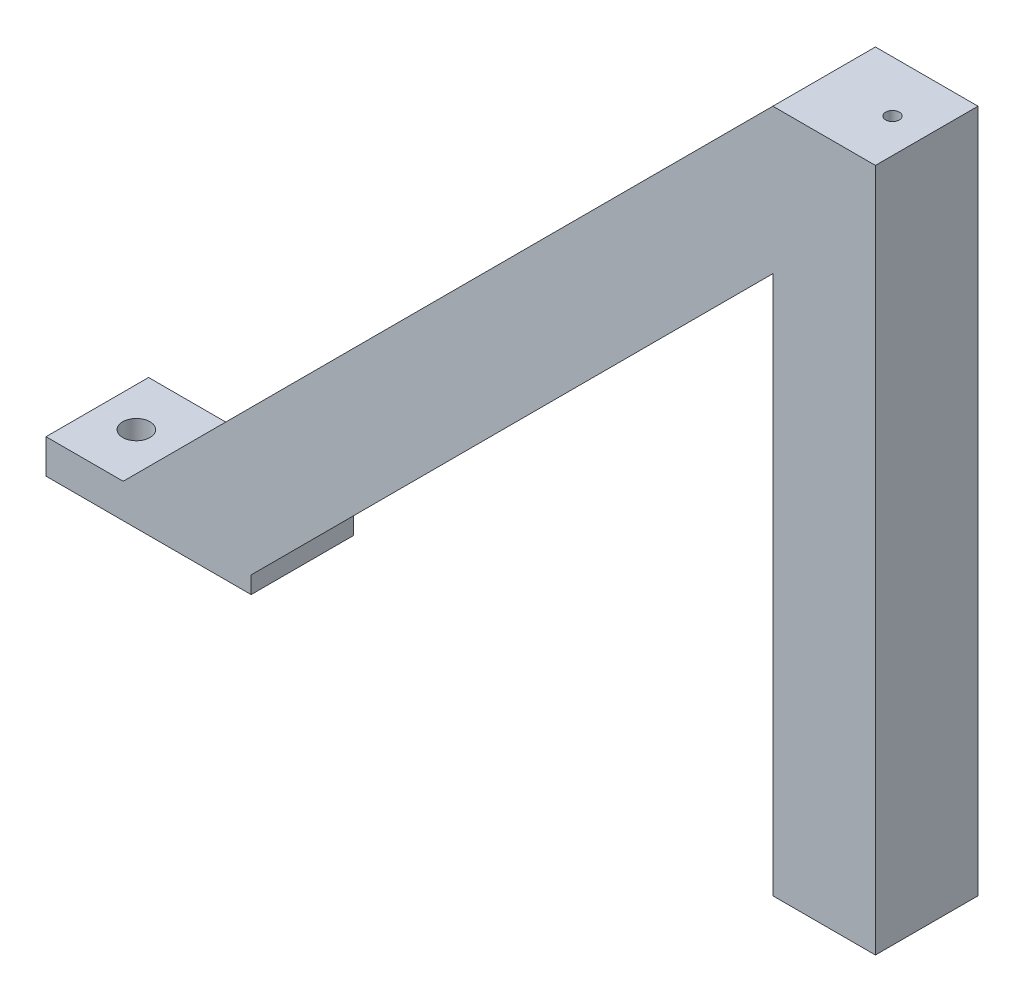
ISO-10303-21;
HEADER;
FILE_DESCRIPTION(('STEP AP214'),'2;1');
FILE_NAME('part.step','',(''),(''),'','','');
FILE_SCHEMA(('AUTOMOTIVE_DESIGN { 1 0 10303 214 1 1 1 1 }'));
ENDSEC;
DATA;
#1=APPLICATION_CONTEXT('core data for automotive mechanical design processes');
#2=APPLICATION_PROTOCOL_DEFINITION('international standard','automotive_design',2000,#1);
#3=PRODUCT_CONTEXT('',#1,'mechanical');
#4=PRODUCT('Part','Part','',(#3));
#5=PRODUCT_RELATED_PRODUCT_CATEGORY('part','',(#4));
#6=PRODUCT_DEFINITION_FORMATION('','',#4);
#7=PRODUCT_DEFINITION_CONTEXT('part definition',#1,'design');
#8=PRODUCT_DEFINITION('design','',#6,#7);
#9=PRODUCT_DEFINITION_SHAPE('','',#8);
#10=(LENGTH_UNIT() NAMED_UNIT(*) SI_UNIT(.MILLI.,.METRE.));
#11=(NAMED_UNIT(*) PLANE_ANGLE_UNIT() SI_UNIT($,.RADIAN.));
#12=(NAMED_UNIT(*) SI_UNIT($,.STERADIAN.) SOLID_ANGLE_UNIT());
#13=UNCERTAINTY_MEASURE_WITH_UNIT(LENGTH_MEASURE(1.E-05),#10,'distance_accuracy_value','');
#14=(GEOMETRIC_REPRESENTATION_CONTEXT(3) GLOBAL_UNCERTAINTY_ASSIGNED_CONTEXT((#13)) GLOBAL_UNIT_ASSIGNED_CONTEXT((#10,
#11,#12)) REPRESENTATION_CONTEXT('',''));
#15=CARTESIAN_POINT('',(0.,0.,0.));
#16=DIRECTION('',(0.,0.,1.));
#17=DIRECTION('',(1.,0.,0.));
#18=AXIS2_PLACEMENT_3D('',#15,#16,#17);
#19=CARTESIAN_POINT('',(-73.025,73.0250000000002,9.525));
#20=DIRECTION('',(0.707106781186546,-0.707106781186549,0.));
#21=DIRECTION('',(0.707106781186549,0.707106781186546,0.));
#22=AXIS2_PLACEMENT_3D('',#19,#20,#21);
#23=PLANE('',#22);
#24=DIRECTION('',(-0.707106781186549,-0.707106781186546,0.));
#25=VECTOR('',#24,1.);
#26=CARTESIAN_POINT('',(-73.025,73.0250000000002,-9.525));
#27=LINE('',#26,#25);
#28=CARTESIAN_POINT('',(-19.05,127.,-9.525));
#29=VERTEX_POINT('',#28);
#30=CARTESIAN_POINT('',(-139.7,6.35,-9.525));
#31=VERTEX_POINT('',#30);
#32=EDGE_CURVE('E133',#29,#31,#27,.T.);
#33=ORIENTED_EDGE('',*,*,#32,.T.);
#34=DIRECTION('',(0.,0.,1.));
#35=VECTOR('',#34,1.);
#36=CARTESIAN_POINT('',(-139.7,6.34999999999998,9.525));
#37=LINE('',#36,#35);
#38=CARTESIAN_POINT('',(-139.7,6.35,9.525));
#39=VERTEX_POINT('',#38);
#40=EDGE_CURVE('E181',#31,#39,#37,.T.);
#41=ORIENTED_EDGE('',*,*,#40,.T.);
#42=DIRECTION('',(-0.707106781186549,-0.707106781186546,0.));
#43=VECTOR('',#42,1.);
#44=CARTESIAN_POINT('',(-73.025,73.0250000000002,9.525));
#45=LINE('',#44,#43);
#46=CARTESIAN_POINT('',(-19.05,127.,9.525));
#47=VERTEX_POINT('',#46);
#48=EDGE_CURVE('E152',#47,#39,#45,.T.);
#49=ORIENTED_EDGE('',*,*,#48,.F.);
#50=DIRECTION('',(0.,0.,-1.));
#51=VECTOR('',#50,1.);
#52=CARTESIAN_POINT('',(-19.05,127.,9.525));
#53=LINE('',#52,#51);
#54=EDGE_CURVE('E132',#47,#29,#53,.T.);
#55=ORIENTED_EDGE('',*,*,#54,.T.);
#56=EDGE_LOOP('',(#33,#41,#49,#55));
#57=FACE_BOUND('',#56,.T.);
#58=ADVANCED_FACE('F41',(#57),#23,.F.);
#59=CARTESIAN_POINT('',(-59.5546158183963,59.5546158183965,9.525));
#60=DIRECTION('',(-0.707106781186546,0.707106781186549,0.));
#61=DIRECTION('',(-0.707106781186549,-0.707106781186546,0.));
#62=AXIS2_PLACEMENT_3D('',#59,#60,#61);
#63=PLANE('',#62);
#64=DIRECTION('',(0.707106781186549,0.707106781186546,0.));
#65=VECTOR('',#64,1.);
#66=CARTESIAN_POINT('',(-59.5546158183963,59.5546158183965,-9.525));
#67=LINE('',#66,#65);
#68=CARTESIAN_POINT('',(-115.934231636793,3.17499999999999,-9.525));
#69=VERTEX_POINT('',#68);
#70=CARTESIAN_POINT('',(-19.05,100.059231636793,-9.525));
#71=VERTEX_POINT('',#70);
#72=EDGE_CURVE('E137',#69,#71,#67,.T.);
#73=ORIENTED_EDGE('',*,*,#72,.T.);
#74=DIRECTION('',(0.,0.,-1.));
#75=VECTOR('',#74,1.);
#76=CARTESIAN_POINT('',(-19.05,100.059231636793,9.525));
#77=LINE('',#76,#75);
#78=CARTESIAN_POINT('',(-19.05,100.059231636793,9.525));
#79=VERTEX_POINT('',#78);
#80=EDGE_CURVE('E51',#79,#71,#77,.T.);
#81=ORIENTED_EDGE('',*,*,#80,.F.);
#82=DIRECTION('',(0.707106781186549,0.707106781186546,0.));
#83=VECTOR('',#82,1.);
#84=CARTESIAN_POINT('',(-59.5546158183963,59.5546158183965,9.525));
#85=LINE('',#84,#83);
#86=CARTESIAN_POINT('',(-115.934231636793,3.17499999999998,9.525));
#87=VERTEX_POINT('',#86);
#88=EDGE_CURVE('E96',#87,#79,#85,.T.);
#89=ORIENTED_EDGE('',*,*,#88,.F.);
#90=DIRECTION('',(0.,0.,-1.));
#91=VECTOR('',#90,1.);
#92=CARTESIAN_POINT('',(-115.934231636793,3.17499999999999,9.525));
#93=LINE('',#92,#91);
#94=EDGE_CURVE('E11',#87,#69,#93,.T.);
#95=ORIENTED_EDGE('',*,*,#94,.T.);
#96=EDGE_LOOP('',(#73,#81,#89,#95));
#97=FACE_BOUND('',#96,.T.);
#98=ADVANCED_FACE('F165',(#97),#63,.F.);
#99=CARTESIAN_POINT('',(-19.05,0.,9.525));
#100=DIRECTION('',(-1.,0.,0.));
#101=DIRECTION('',(0.,0.,1.));
#102=AXIS2_PLACEMENT_3D('',#99,#100,#101);
#103=PLANE('',#102);
#104=DIRECTION('',(0.,1.,0.));
#105=VECTOR('',#104,1.);
#106=CARTESIAN_POINT('',(-19.05,0.,-9.525));
#107=LINE('',#106,#105);
#108=CARTESIAN_POINT('',(-19.05,0.,-9.525));
#109=VERTEX_POINT('',#108);
#110=EDGE_CURVE('E142',#109,#71,#107,.T.);
#111=ORIENTED_EDGE('',*,*,#110,.F.);
#112=DIRECTION('',(0.,0.,-1.));
#113=VECTOR('',#112,1.);
#114=CARTESIAN_POINT('',(-19.05,0.,9.525));
#115=LINE('',#114,#113);
#116=CARTESIAN_POINT('',(-19.05,0.,9.525));
#117=VERTEX_POINT('',#116);
#118=EDGE_CURVE('E114',#117,#109,#115,.T.);
#119=ORIENTED_EDGE('',*,*,#118,.F.);
#120=DIRECTION('',(0.,1.,0.));
#121=VECTOR('',#120,1.);
#122=CARTESIAN_POINT('',(-19.05,0.,9.525));
#123=LINE('',#122,#121);
#124=EDGE_CURVE('E123',#117,#79,#123,.T.);
#125=ORIENTED_EDGE('',*,*,#124,.T.);
#126=ORIENTED_EDGE('',*,*,#80,.T.);
#127=EDGE_LOOP('',(#111,#119,#125,#126));
#128=FACE_BOUND('',#127,.T.);
#129=ADVANCED_FACE('F162',(#128),#103,.T.);
#130=CARTESIAN_POINT('',(0.,0.,9.525));
#131=DIRECTION('',(0.,-1.,0.));
#132=DIRECTION('',(1.,0.,0.));
#133=AXIS2_PLACEMENT_3D('',#130,#131,#132);
#134=PLANE('',#133);
#135=DIRECTION('',(-1.,0.,0.));
#136=VECTOR('',#135,1.);
#137=CARTESIAN_POINT('',(0.,0.,-9.525));
#138=LINE('',#137,#136);
#139=CARTESIAN_POINT('',(0.,0.,-9.525));
#140=VERTEX_POINT('',#139);
#141=EDGE_CURVE('E112',#140,#109,#138,.T.);
#142=ORIENTED_EDGE('',*,*,#141,.F.);
#143=DIRECTION('',(0.,0.,-1.));
#144=VECTOR('',#143,1.);
#145=CARTESIAN_POINT('',(0.,0.,9.525));
#146=LINE('',#145,#144);
#147=CARTESIAN_POINT('',(0.,0.,9.525));
#148=VERTEX_POINT('',#147);
#149=EDGE_CURVE('E106',#148,#140,#146,.T.);
#150=ORIENTED_EDGE('',*,*,#149,.F.);
#151=DIRECTION('',(-1.,0.,0.));
#152=VECTOR('',#151,1.);
#153=CARTESIAN_POINT('',(0.,0.,9.525));
#154=LINE('',#153,#152);
#155=EDGE_CURVE('E110',#148,#117,#154,.T.);
#156=ORIENTED_EDGE('',*,*,#155,.T.);
#157=ORIENTED_EDGE('',*,*,#118,.T.);
#158=EDGE_LOOP('',(#142,#150,#156,#157));
#159=FACE_BOUND('',#158,.T.);
#160=ADVANCED_FACE('F108',(#159),#134,.T.);
#161=CARTESIAN_POINT('',(0.,0.,9.525));
#162=DIRECTION('',(-1.,0.,0.));
#163=DIRECTION('',(0.,0.,1.));
#164=AXIS2_PLACEMENT_3D('',#161,#162,#163);
#165=PLANE('',#164);
#166=DIRECTION('',(0.,1.,0.));
#167=VECTOR('',#166,1.);
#168=CARTESIAN_POINT('',(0.,0.,-9.525));
#169=LINE('',#168,#167);
#170=CARTESIAN_POINT('',(0.,127.,-9.525));
#171=VERTEX_POINT('',#170);
#172=EDGE_CURVE('E82',#140,#171,#169,.T.);
#173=ORIENTED_EDGE('',*,*,#172,.T.);
#174=DIRECTION('',(0.,0.,-1.));
#175=VECTOR('',#174,1.);
#176=CARTESIAN_POINT('',(0.,127.,9.525));
#177=LINE('',#176,#175);
#178=CARTESIAN_POINT('',(0.,127.,9.525));
#179=VERTEX_POINT('',#178);
#180=EDGE_CURVE('E115',#179,#171,#177,.T.);
#181=ORIENTED_EDGE('',*,*,#180,.F.);
#182=DIRECTION('',(0.,1.,0.));
#183=VECTOR('',#182,1.);
#184=CARTESIAN_POINT('',(0.,0.,9.525));
#185=LINE('',#184,#183);
#186=EDGE_CURVE('E117',#148,#179,#185,.T.);
#187=ORIENTED_EDGE('',*,*,#186,.F.);
#188=ORIENTED_EDGE('',*,*,#149,.T.);
#189=EDGE_LOOP('',(#173,#181,#187,#188));
#190=FACE_BOUND('',#189,.T.);
#191=ADVANCED_FACE('F118',(#190),#165,.F.);
#192=CARTESIAN_POINT('',(0.,127.,9.525));
#193=DIRECTION('',(0.,-1.,0.));
#194=DIRECTION('',(0.,0.,-1.));
#195=AXIS2_PLACEMENT_3D('',#192,#193,#194);
#196=PLANE('',#195);
#197=CARTESIAN_POINT('',(-6.35,127.,0.));
#198=DIRECTION('',(0.,1.,0.));
#199=DIRECTION('',(0.,0.,1.));
#200=AXIS2_PLACEMENT_3D('',#197,#198,#199);
#201=CIRCLE('',#200,1.27);
#202=CARTESIAN_POINT('',(-6.35,127.,1.27));
#203=VERTEX_POINT('',#202);
#204=EDGE_CURVE('E239',#203,#203,#201,.T.);
#205=ORIENTED_EDGE('',*,*,#204,.F.);
#206=EDGE_LOOP('',(#205));
#207=FACE_BOUND('',#206,.T.);
#208=DIRECTION('',(-1.,0.,0.));
#209=VECTOR('',#208,1.);
#210=CARTESIAN_POINT('',(0.,127.,-9.525));
#211=LINE('',#210,#209);
#212=EDGE_CURVE('E88',#171,#29,#211,.T.);
#213=ORIENTED_EDGE('',*,*,#212,.T.);
#214=ORIENTED_EDGE('',*,*,#54,.F.);
#215=DIRECTION('',(-1.,0.,0.));
#216=VECTOR('',#215,1.);
#217=CARTESIAN_POINT('',(0.,127.,9.525));
#218=LINE('',#217,#216);
#219=EDGE_CURVE('E59',#179,#47,#218,.T.);
#220=ORIENTED_EDGE('',*,*,#219,.F.);
#221=ORIENTED_EDGE('',*,*,#180,.T.);
#222=EDGE_LOOP('',(#213,#214,#220,#221));
#223=FACE_BOUND('',#222,.T.);
#224=ADVANCED_FACE('F296',(#207,#223),#196,.F.);
#225=CARTESIAN_POINT('',(0.,0.,9.525));
#226=DIRECTION('',(0.,0.,1.));
#227=DIRECTION('',(1.,0.,0.));
#228=AXIS2_PLACEMENT_3D('',#225,#226,#227);
#229=PLANE('',#228);
#230=ORIENTED_EDGE('',*,*,#48,.T.);
#231=DIRECTION('',(-1.,0.,0.));
#232=VECTOR('',#231,1.);
#233=CARTESIAN_POINT('',(-115.934231636793,6.35,9.525));
#234=LINE('',#233,#232);
#235=CARTESIAN_POINT('',(-154.034231636793,6.35,9.525));
#236=VERTEX_POINT('',#235);
#237=EDGE_CURVE('E202',#39,#236,#234,.T.);
#238=ORIENTED_EDGE('',*,*,#237,.T.);
#239=DIRECTION('',(0.,-1.,0.));
#240=VECTOR('',#239,1.);
#241=CARTESIAN_POINT('',(-154.034231636793,0.,9.525));
#242=LINE('',#241,#240);
#243=CARTESIAN_POINT('',(-154.034231636793,0.,9.525));
#244=VERTEX_POINT('',#243);
#245=EDGE_CURVE('E206',#236,#244,#242,.T.);
#246=ORIENTED_EDGE('',*,*,#245,.T.);
#247=DIRECTION('',(1.,0.,0.));
#248=VECTOR('',#247,1.);
#249=CARTESIAN_POINT('',(-115.934231636793,0.,9.525));
#250=LINE('',#249,#248);
#251=CARTESIAN_POINT('',(-115.934231636793,0.,9.525));
#252=VERTEX_POINT('',#251);
#253=EDGE_CURVE('E218',#244,#252,#250,.T.);
#254=ORIENTED_EDGE('',*,*,#253,.T.);
#255=DIRECTION('',(0.,1.,0.));
#256=VECTOR('',#255,1.);
#257=CARTESIAN_POINT('',(-115.934231636793,0.,9.525));
#258=LINE('',#257,#256);
#259=EDGE_CURVE('E209',#252,#87,#258,.T.);
#260=ORIENTED_EDGE('',*,*,#259,.T.);
#261=ORIENTED_EDGE('',*,*,#88,.T.);
#262=ORIENTED_EDGE('',*,*,#124,.F.);
#263=ORIENTED_EDGE('',*,*,#155,.F.);
#264=ORIENTED_EDGE('',*,*,#186,.T.);
#265=ORIENTED_EDGE('',*,*,#219,.T.);
#266=EDGE_LOOP('',(#230,#238,#246,#254,#260,#261,#262,#263,#264,#265));
#267=FACE_BOUND('',#266,.T.);
#268=ADVANCED_FACE('F121',(#267),#229,.T.);
#269=CARTESIAN_POINT('',(0.,0.,-9.525));
#270=DIRECTION('',(0.,0.,1.));
#271=DIRECTION('',(1.,0.,0.));
#272=AXIS2_PLACEMENT_3D('',#269,#270,#271);
#273=PLANE('',#272);
#274=ORIENTED_EDGE('',*,*,#72,.F.);
#275=DIRECTION('',(0.,-1.,0.));
#276=VECTOR('',#275,1.);
#277=CARTESIAN_POINT('',(-115.934231636793,0.,-9.525));
#278=LINE('',#277,#276);
#279=CARTESIAN_POINT('',(-115.934231636793,0.,-9.525));
#280=VERTEX_POINT('',#279);
#281=EDGE_CURVE('E236',#69,#280,#278,.T.);
#282=ORIENTED_EDGE('',*,*,#281,.T.);
#283=DIRECTION('',(-1.,0.,0.));
#284=VECTOR('',#283,1.);
#285=CARTESIAN_POINT('',(-115.934231636793,0.,-9.525));
#286=LINE('',#285,#284);
#287=CARTESIAN_POINT('',(-154.034231636793,0.,-9.525));
#288=VERTEX_POINT('',#287);
#289=EDGE_CURVE('E250',#280,#288,#286,.T.);
#290=ORIENTED_EDGE('',*,*,#289,.T.);
#291=DIRECTION('',(0.,1.,0.));
#292=VECTOR('',#291,1.);
#293=CARTESIAN_POINT('',(-154.034231636793,0.,-9.525));
#294=LINE('',#293,#292);
#295=CARTESIAN_POINT('',(-154.034231636793,6.35,-9.525));
#296=VERTEX_POINT('',#295);
#297=EDGE_CURVE('E231',#288,#296,#294,.T.);
#298=ORIENTED_EDGE('',*,*,#297,.T.);
#299=DIRECTION('',(1.,0.,0.));
#300=VECTOR('',#299,1.);
#301=CARTESIAN_POINT('',(-115.934231636793,6.35,-9.525));
#302=LINE('',#301,#300);
#303=EDGE_CURVE('E175',#296,#31,#302,.T.);
#304=ORIENTED_EDGE('',*,*,#303,.T.);
#305=ORIENTED_EDGE('',*,*,#32,.F.);
#306=ORIENTED_EDGE('',*,*,#212,.F.);
#307=ORIENTED_EDGE('',*,*,#172,.F.);
#308=ORIENTED_EDGE('',*,*,#141,.T.);
#309=ORIENTED_EDGE('',*,*,#110,.T.);
#310=EDGE_LOOP('',(#274,#282,#290,#298,#304,#305,#306,#307,#308,#309));
#311=FACE_BOUND('',#310,.T.);
#312=ADVANCED_FACE('F169',(#311),#273,.F.);
#313=CARTESIAN_POINT('',(-6.35,120.65,0.));
#314=DIRECTION('',(0.,1.,0.));
#315=DIRECTION('',(0.,0.,1.));
#316=AXIS2_PLACEMENT_3D('',#313,#314,#315);
#317=CYLINDRICAL_SURFACE('',#316,1.27);
#318=CARTESIAN_POINT('',(-6.35,120.65,0.));
#319=DIRECTION('',(0.,1.,0.));
#320=DIRECTION('',(0.,0.,1.));
#321=AXIS2_PLACEMENT_3D('',#318,#319,#320);
#322=CIRCLE('',#321,1.27);
#323=CARTESIAN_POINT('',(-6.35,120.65,1.27));
#324=VERTEX_POINT('',#323);
#325=EDGE_CURVE('E138',#324,#324,#322,.T.);
#326=ORIENTED_EDGE('',*,*,#325,.F.);
#327=EDGE_LOOP('',(#326));
#328=FACE_BOUND('',#327,.T.);
#329=ORIENTED_EDGE('',*,*,#204,.T.);
#330=EDGE_LOOP('',(#329));
#331=FACE_BOUND('',#330,.T.);
#332=ADVANCED_FACE('F302',(#328,#331),#317,.F.);
#333=CARTESIAN_POINT('',(-6.35,120.65,0.));
#334=DIRECTION('',(0.,1.,0.));
#335=DIRECTION('',(0.,0.,1.));
#336=AXIS2_PLACEMENT_3D('',#333,#334,#335);
#337=PLANE('',#336);
#338=ORIENTED_EDGE('',*,*,#325,.T.);
#339=EDGE_LOOP('',(#338));
#340=FACE_BOUND('',#339,.T.);
#341=ADVANCED_FACE('F279',(#340),#337,.T.);
#342=CARTESIAN_POINT('',(-115.934231636793,0.,-48.1505420673937));
#343=DIRECTION('',(1.,0.,0.));
#344=DIRECTION('',(0.,0.,-1.));
#345=AXIS2_PLACEMENT_3D('',#342,#343,#344);
#346=PLANE('',#345);
#347=ORIENTED_EDGE('',*,*,#94,.F.);
#348=ORIENTED_EDGE('',*,*,#259,.F.);
#349=DIRECTION('',(0.,0.,1.));
#350=VECTOR('',#349,1.);
#351=CARTESIAN_POINT('',(-115.934231636793,0.,-48.1505420673937));
#352=LINE('',#351,#350);
#353=EDGE_CURVE('E228',#280,#252,#352,.T.);
#354=ORIENTED_EDGE('',*,*,#353,.F.);
#355=ORIENTED_EDGE('',*,*,#281,.F.);
#356=EDGE_LOOP('',(#347,#348,#354,#355));
#357=FACE_BOUND('',#356,.T.);
#358=ADVANCED_FACE('F271',(#357),#346,.T.);
#359=CARTESIAN_POINT('',(-115.934231636793,6.35,-48.1505420673937));
#360=DIRECTION('',(0.,1.,0.));
#361=DIRECTION('',(-1.,0.,0.));
#362=AXIS2_PLACEMENT_3D('',#359,#360,#361);
#363=PLANE('',#362);
#364=CARTESIAN_POINT('',(-146.779052356176,6.34999999999999,0.));
#365=DIRECTION('',(0.,1.,0.));
#366=DIRECTION('',(-1.,0.,0.));
#367=AXIS2_PLACEMENT_3D('',#364,#365,#366);
#368=CIRCLE('',#367,2.53999999999998);
#369=CARTESIAN_POINT('',(-149.319052356176,6.34999999999999,0.));
#370=VERTEX_POINT('',#369);
#371=EDGE_CURVE('E256',#370,#370,#368,.T.);
#372=ORIENTED_EDGE('',*,*,#371,.F.);
#373=EDGE_LOOP('',(#372));
#374=FACE_BOUND('',#373,.T.);
#375=ORIENTED_EDGE('',*,*,#40,.F.);
#376=ORIENTED_EDGE('',*,*,#303,.F.);
#377=DIRECTION('',(0.,0.,1.));
#378=VECTOR('',#377,1.);
#379=CARTESIAN_POINT('',(-154.034231636793,6.35,-48.1505420673937));
#380=LINE('',#379,#378);
#381=EDGE_CURVE('E212',#296,#236,#380,.T.);
#382=ORIENTED_EDGE('',*,*,#381,.T.);
#383=ORIENTED_EDGE('',*,*,#237,.F.);
#384=EDGE_LOOP('',(#375,#376,#382,#383));
#385=FACE_BOUND('',#384,.T.);
#386=ADVANCED_FACE('F213',(#374,#385),#363,.T.);
#387=CARTESIAN_POINT('',(-115.934231636793,0.,-48.1505420673937));
#388=DIRECTION('',(0.,-1.,0.));
#389=DIRECTION('',(1.,0.,0.));
#390=AXIS2_PLACEMENT_3D('',#387,#388,#389);
#391=PLANE('',#390);
#392=CARTESIAN_POINT('',(-146.779052356176,0.,0.));
#393=DIRECTION('',(0.,-1.,0.));
#394=DIRECTION('',(1.,0.,0.));
#395=AXIS2_PLACEMENT_3D('',#392,#393,#394);
#396=CIRCLE('',#395,2.53999999999998);
#397=CARTESIAN_POINT('',(-149.319052356176,0.,0.));
#398=VERTEX_POINT('',#397);
#399=EDGE_CURVE('E44',#398,#398,#396,.T.);
#400=ORIENTED_EDGE('',*,*,#399,.F.);
#401=EDGE_LOOP('',(#400));
#402=FACE_BOUND('',#401,.T.);
#403=ORIENTED_EDGE('',*,*,#289,.F.);
#404=ORIENTED_EDGE('',*,*,#353,.T.);
#405=ORIENTED_EDGE('',*,*,#253,.F.);
#406=DIRECTION('',(0.,0.,1.));
#407=VECTOR('',#406,1.);
#408=CARTESIAN_POINT('',(-154.034231636793,0.,-48.1505420673937));
#409=LINE('',#408,#407);
#410=EDGE_CURVE('E217',#288,#244,#409,.T.);
#411=ORIENTED_EDGE('',*,*,#410,.F.);
#412=EDGE_LOOP('',(#403,#404,#405,#411));
#413=FACE_BOUND('',#412,.T.);
#414=ADVANCED_FACE('F270',(#402,#413),#391,.T.);
#415=CARTESIAN_POINT('',(-154.034231636793,0.,-48.1505420673937));
#416=DIRECTION('',(-1.,0.,0.));
#417=DIRECTION('',(0.,0.,1.));
#418=AXIS2_PLACEMENT_3D('',#415,#416,#417);
#419=PLANE('',#418);
#420=ORIENTED_EDGE('',*,*,#297,.F.);
#421=ORIENTED_EDGE('',*,*,#410,.T.);
#422=ORIENTED_EDGE('',*,*,#245,.F.);
#423=ORIENTED_EDGE('',*,*,#381,.F.);
#424=EDGE_LOOP('',(#420,#421,#422,#423));
#425=FACE_BOUND('',#424,.T.);
#426=ADVANCED_FACE('F220',(#425),#419,.T.);
#427=CARTESIAN_POINT('',(-146.779052356176,-3.17500000000001,0.));
#428=DIRECTION('',(0.,1.,0.));
#429=DIRECTION('',(-1.,0.,0.));
#430=AXIS2_PLACEMENT_3D('',#427,#428,#429);
#431=CYLINDRICAL_SURFACE('',#430,2.53999999999998);
#432=CARTESIAN_POINT('',(-149.319052356176,0.,0.));
#433=CARTESIAN_POINT('',(-149.319052356176,0.0661458333333298,0.));
#434=CARTESIAN_POINT('',(-149.319052356176,0.132291666666663,0.));
#435=CARTESIAN_POINT('',(-149.319052356176,0.26458333333333,0.));
#436=CARTESIAN_POINT('',(-149.319052356176,0.330729166666663,0.));
#437=CARTESIAN_POINT('',(-149.319052356176,0.463020833333329,0.));
#438=CARTESIAN_POINT('',(-149.319052356176,0.529166666666663,0.));
#439=CARTESIAN_POINT('',(-149.319052356176,0.661458333333329,0.));
#440=CARTESIAN_POINT('',(-149.319052356176,0.727604166666662,0.));
#441=CARTESIAN_POINT('',(-149.319052356176,0.859895833333329,0.));
#442=CARTESIAN_POINT('',(-149.319052356176,0.926041666666662,0.));
#443=CARTESIAN_POINT('',(-149.319052356176,1.05833333333333,0.));
#444=CARTESIAN_POINT('',(-149.319052356176,1.12447916666666,0.));
#445=CARTESIAN_POINT('',(-149.319052356176,1.25677083333333,0.));
#446=CARTESIAN_POINT('',(-149.319052356176,1.32291666666666,0.));
#447=CARTESIAN_POINT('',(-149.319052356176,1.45520833333333,0.));
#448=CARTESIAN_POINT('',(-149.319052356176,1.52135416666666,0.));
#449=CARTESIAN_POINT('',(-149.319052356176,1.65364583333333,0.));
#450=CARTESIAN_POINT('',(-149.319052356176,1.71979166666666,0.));
#451=CARTESIAN_POINT('',(-149.319052356176,1.85208333333333,0.));
#452=CARTESIAN_POINT('',(-149.319052356176,1.91822916666666,0.));
#453=CARTESIAN_POINT('',(-149.319052356176,2.05052083333333,0.));
#454=CARTESIAN_POINT('',(-149.319052356176,2.11666666666666,0.));
#455=CARTESIAN_POINT('',(-149.319052356176,2.24895833333333,0.));
#456=CARTESIAN_POINT('',(-149.319052356176,2.31510416666666,0.));
#457=CARTESIAN_POINT('',(-149.319052356176,2.44739583333333,0.));
#458=CARTESIAN_POINT('',(-149.319052356176,2.51354166666666,0.));
#459=CARTESIAN_POINT('',(-149.319052356176,2.64583333333333,0.));
#460=CARTESIAN_POINT('',(-149.319052356176,2.71197916666666,0.));
#461=CARTESIAN_POINT('',(-149.319052356176,2.84427083333333,0.));
#462=CARTESIAN_POINT('',(-149.319052356176,2.91041666666666,0.));
#463=CARTESIAN_POINT('',(-149.319052356176,3.04270833333333,0.));
#464=CARTESIAN_POINT('',(-149.319052356176,3.10885416666666,0.));
#465=CARTESIAN_POINT('',(-149.319052356176,3.24114583333333,0.));
#466=CARTESIAN_POINT('',(-149.319052356176,3.30729166666666,0.));
#467=CARTESIAN_POINT('',(-149.319052356176,3.43958333333333,0.));
#468=CARTESIAN_POINT('',(-149.319052356176,3.50572916666666,0.));
#469=CARTESIAN_POINT('',(-149.319052356176,3.63802083333333,0.));
#470=CARTESIAN_POINT('',(-149.319052356176,3.70416666666666,0.));
#471=CARTESIAN_POINT('',(-149.319052356176,3.83645833333333,0.));
#472=CARTESIAN_POINT('',(-149.319052356176,3.90260416666666,0.));
#473=CARTESIAN_POINT('',(-149.319052356176,4.03489583333333,0.));
#474=CARTESIAN_POINT('',(-149.319052356176,4.10104166666666,0.));
#475=CARTESIAN_POINT('',(-149.319052356176,4.23333333333333,0.));
#476=CARTESIAN_POINT('',(-149.319052356176,4.29947916666666,0.));
#477=CARTESIAN_POINT('',(-149.319052356176,4.43177083333333,0.));
#478=CARTESIAN_POINT('',(-149.319052356176,4.49791666666666,0.));
#479=CARTESIAN_POINT('',(-149.319052356176,4.63020833333333,0.));
#480=CARTESIAN_POINT('',(-149.319052356176,4.69635416666666,0.));
#481=CARTESIAN_POINT('',(-149.319052356176,4.82864583333333,0.));
#482=CARTESIAN_POINT('',(-149.319052356176,4.89479166666666,0.));
#483=CARTESIAN_POINT('',(-149.319052356176,5.02708333333333,0.));
#484=CARTESIAN_POINT('',(-149.319052356176,5.09322916666666,0.));
#485=CARTESIAN_POINT('',(-149.319052356176,5.22552083333333,0.));
#486=CARTESIAN_POINT('',(-149.319052356176,5.29166666666666,0.));
#487=CARTESIAN_POINT('',(-149.319052356176,5.42395833333333,0.));
#488=CARTESIAN_POINT('',(-149.319052356176,5.49010416666666,0.));
#489=CARTESIAN_POINT('',(-149.319052356176,5.62239583333333,0.));
#490=CARTESIAN_POINT('',(-149.319052356176,5.68854166666666,0.));
#491=CARTESIAN_POINT('',(-149.319052356176,5.82083333333333,0.));
#492=CARTESIAN_POINT('',(-149.319052356176,5.88697916666666,0.));
#493=CARTESIAN_POINT('',(-149.319052356176,6.01927083333333,0.));
#494=CARTESIAN_POINT('',(-149.319052356176,6.08541666666666,0.));
#495=CARTESIAN_POINT('',(-149.319052356176,6.21770833333333,0.));
#496=CARTESIAN_POINT('',(-149.319052356176,6.28385416666666,0.));
#497=CARTESIAN_POINT('',(-149.319052356176,6.34999999999999,0.));
#498=B_SPLINE_CURVE_WITH_KNOTS('',3,(#432,#433,#434,#435,#436,#437,#438,#439,#440,#441,#442,
#443,#444,#445,#446,#447,#448,#449,#450,#451,#452,#453,#454,#455,#456,#457,#458,#459,#460,#461,
#462,#463,#464,#465,#466,#467,#468,#469,#470,#471,#472,#473,#474,#475,#476,#477,#478,#479,#480,
#481,#482,#483,#484,#485,#486,#487,#488,#489,#490,#491,#492,#493,#494,#495,#496,#497),
.UNSPECIFIED.,.F.,.F.,(4,2,2,2,2,2,2,2,2,2,2,2,2,2,2,2,2,2,2,2,2,2,2,2,2,2,2,2,2,2,2,2,4),(0.,
0.1984375,0.396875,0.595312499999999,0.793749999999999,0.992187499999999,1.190625,1.3890625,
1.5875,1.7859375,1.984375,2.1828125,2.38125,2.5796875,2.778125,2.9765625,3.175,3.3734375,
3.571875,3.7703125,3.96875,4.1671875,4.365625,4.5640625,4.7625,4.9609375,5.159375,5.3578125,
5.55625,5.7546875,5.953125,6.1515625,6.35),.UNSPECIFIED.);
#499=EDGE_CURVE('BSEAM267',#398,#370,#498,.T.);
#500=ORIENTED_EDGE('',*,*,#399,.T.);
#501=ORIENTED_EDGE('',*,*,#371,.T.);
#502=ORIENTED_EDGE('',*,*,#499,.T.);
#503=ORIENTED_EDGE('',*,*,#499,.F.);
#504=EDGE_LOOP('',(#500,#502,#501,#503));
#505=FACE_BOUND('',#504,.T.);
#506=ADVANCED_FACE('F267',(#505),#431,.F.);
#507=CLOSED_SHELL('',(#58,#98,#129,#160,#191,#224,#268,#312,#332,#341,#358,#386,#414,#426,#506));
#508=MANIFOLD_SOLID_BREP('B2',#507);
#509=ADVANCED_BREP_SHAPE_REPRESENTATION('',(#18,#508),#14);
#510=SHAPE_DEFINITION_REPRESENTATION(#9,#509);
ENDSEC;
END-ISO-10303-21;
